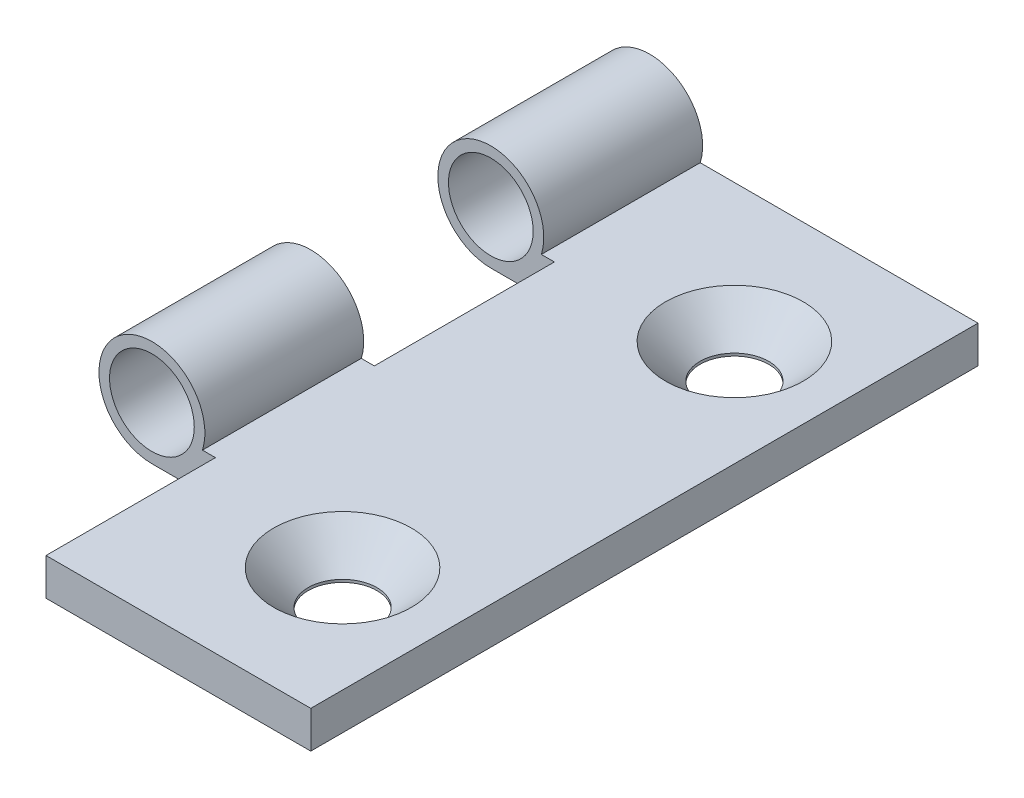
ISO-10303-21;
HEADER;
FILE_DESCRIPTION(('STEP AP214'),'2;1');
FILE_NAME('part.step','',(''),(''),'','','');
FILE_SCHEMA(('AUTOMOTIVE_DESIGN { 1 0 10303 214 1 1 1 1 }'));
ENDSEC;
DATA;
#1=APPLICATION_CONTEXT('core data for automotive mechanical design processes');
#2=APPLICATION_PROTOCOL_DEFINITION('international standard','automotive_design',2000,#1);
#3=PRODUCT_CONTEXT('',#1,'mechanical');
#4=PRODUCT('Part','Part','',(#3));
#5=PRODUCT_RELATED_PRODUCT_CATEGORY('part','',(#4));
#6=PRODUCT_DEFINITION_FORMATION('','',#4);
#7=PRODUCT_DEFINITION_CONTEXT('part definition',#1,'design');
#8=PRODUCT_DEFINITION('design','',#6,#7);
#9=PRODUCT_DEFINITION_SHAPE('','',#8);
#10=(LENGTH_UNIT() NAMED_UNIT(*) SI_UNIT(.MILLI.,.METRE.));
#11=(NAMED_UNIT(*) PLANE_ANGLE_UNIT() SI_UNIT($,.RADIAN.));
#12=(NAMED_UNIT(*) SI_UNIT($,.STERADIAN.) SOLID_ANGLE_UNIT());
#13=UNCERTAINTY_MEASURE_WITH_UNIT(LENGTH_MEASURE(1.E-05),#10,'distance_accuracy_value','');
#14=(GEOMETRIC_REPRESENTATION_CONTEXT(3) GLOBAL_UNCERTAINTY_ASSIGNED_CONTEXT((#13)) GLOBAL_UNIT_ASSIGNED_CONTEXT((#10,
#11,#12)) REPRESENTATION_CONTEXT('',''));
#15=CARTESIAN_POINT('',(0.,0.,0.));
#16=DIRECTION('',(0.,0.,1.));
#17=DIRECTION('',(1.,0.,0.));
#18=AXIS2_PLACEMENT_3D('',#15,#16,#17);
#19=CARTESIAN_POINT('',(20.9999999999997,3.50000000003098,-18.5));
#20=DIRECTION('',(0.,1.,0.));
#21=DIRECTION('',(-1.,0.,0.));
#22=AXIS2_PLACEMENT_3D('',#19,#20,#21);
#23=CONICAL_SURFACE('',#22,6.50000000011517,0.785398163406194);
#24=CARTESIAN_POINT('',(20.9999999999997,3.49999999993264,-18.5));
#25=DIRECTION('',(0.,-1.,0.));
#26=DIRECTION('',(-1.,0.,0.));
#27=AXIS2_PLACEMENT_3D('',#24,#25,#26);
#28=CIRCLE('',#27,6.50000000001683);
#29=CARTESIAN_POINT('',(14.4999999999828,3.49999999993264,-18.5));
#30=VERTEX_POINT('',#29);
#31=EDGE_CURVE('E41',#30,#30,#28,.T.);
#32=ORIENTED_EDGE('',*,*,#31,.F.);
#33=EDGE_LOOP('',(#32));
#34=FACE_BOUND('',#33,.T.);
#35=CARTESIAN_POINT('',(20.9999999999999,0.249999999994588,-18.4999999999984));
#36=DIRECTION('',(0.,-1.,0.));
#37=DIRECTION('',(-1.,0.,0.));
#38=AXIS2_PLACEMENT_3D('',#35,#36,#37);
#39=CIRCLE('',#38,3.25);
#40=CARTESIAN_POINT('',(17.7499999999999,0.249999999994588,-18.4999999999984));
#41=VERTEX_POINT('',#40);
#42=EDGE_CURVE('E288',#41,#41,#39,.F.);
#43=ORIENTED_EDGE('',*,*,#42,.F.);
#44=EDGE_LOOP('',(#43));
#45=FACE_BOUND('',#44,.T.);
#46=ADVANCED_FACE('F38',(#34,#45),#23,.F.);
#47=CARTESIAN_POINT('',(20.9999999999999,3.49999999991729,18.5));
#48=DIRECTION('',(0.,1.,0.));
#49=DIRECTION('',(-1.,0.,0.));
#50=AXIS2_PLACEMENT_3D('',#47,#48,#49);
#51=CONICAL_SURFACE('',#50,6.50000000005855,0.785398163414939);
#52=CARTESIAN_POINT('',(20.9999999999999,3.49999999993242,18.5));
#53=DIRECTION('',(0.,-1.,0.));
#54=DIRECTION('',(-1.,0.,0.));
#55=AXIS2_PLACEMENT_3D('',#52,#53,#54);
#56=CIRCLE('',#55,6.50000000007367);
#57=CARTESIAN_POINT('',(14.4999999999262,3.49999999993242,18.5));
#58=VERTEX_POINT('',#57);
#59=EDGE_CURVE('E132',#58,#58,#56,.T.);
#60=ORIENTED_EDGE('',*,*,#59,.F.);
#61=EDGE_LOOP('',(#60));
#62=FACE_BOUND('',#61,.T.);
#63=CARTESIAN_POINT('',(20.9999999999999,0.249999999996586,18.5));
#64=DIRECTION('',(0.,-1.,0.));
#65=DIRECTION('',(-1.,0.,0.));
#66=AXIS2_PLACEMENT_3D('',#63,#64,#65);
#67=CIRCLE('',#66,3.25);
#68=CARTESIAN_POINT('',(17.7499999999999,0.249999999996586,18.5));
#69=VERTEX_POINT('',#68);
#70=EDGE_CURVE('E290',#69,#69,#67,.F.);
#71=ORIENTED_EDGE('',*,*,#70,.F.);
#72=EDGE_LOOP('',(#71));
#73=FACE_BOUND('',#72,.T.);
#74=ADVANCED_FACE('F285',(#62,#73),#51,.F.);
#75=CARTESIAN_POINT('',(0.,4.99999999999814,-31.5000000000001));
#76=DIRECTION('',(0.,0.,-1.));
#77=DIRECTION('',(1.,0.,0.));
#78=AXIS2_PLACEMENT_3D('',#75,#76,#77);
#79=CYLINDRICAL_SURFACE('',#78,3.99999999999994);
#80=CARTESIAN_POINT('',(0.,4.99999999999814,-16.5));
#81=DIRECTION('',(0.,0.,1.));
#82=DIRECTION('',(1.,0.,0.));
#83=AXIS2_PLACEMENT_3D('',#80,#81,#82);
#84=CIRCLE('',#83,3.99999999999994);
#85=CARTESIAN_POINT('',(3.99999999999999,4.99999999999814,-16.5));
#86=VERTEX_POINT('',#85);
#87=EDGE_CURVE('E217',#86,#86,#84,.T.);
#88=ORIENTED_EDGE('',*,*,#87,.T.);
#89=EDGE_LOOP('',(#88));
#90=FACE_BOUND('',#89,.T.);
#91=CARTESIAN_POINT('',(0.,4.99999999999814,-31.5000000000001));
#92=DIRECTION('',(0.,0.,1.));
#93=DIRECTION('',(1.,0.,0.));
#94=AXIS2_PLACEMENT_3D('',#91,#92,#93);
#95=CIRCLE('',#94,3.99999999999994);
#96=CARTESIAN_POINT('',(3.99999999999994,4.99999999999814,-31.5000000000001));
#97=VERTEX_POINT('',#96);
#98=EDGE_CURVE('E261',#97,#97,#95,.F.);
#99=ORIENTED_EDGE('',*,*,#98,.T.);
#100=EDGE_LOOP('',(#99));
#101=FACE_BOUND('',#100,.T.);
#102=ADVANCED_FACE('F369',(#90,#101),#79,.F.);
#103=CARTESIAN_POINT('',(0.,4.99999999999814,-31.5000000000001));
#104=DIRECTION('',(0.,0.,-1.));
#105=DIRECTION('',(1.,0.,0.));
#106=AXIS2_PLACEMENT_3D('',#103,#104,#105);
#107=CYLINDRICAL_SURFACE('',#106,3.99999999999994);
#108=CARTESIAN_POINT('',(1.66533453693773E-13,4.9999999999982,15.5000000000001));
#109=DIRECTION('',(0.,0.,1.));
#110=DIRECTION('',(1.,0.,0.));
#111=AXIS2_PLACEMENT_3D('',#108,#109,#110);
#112=CIRCLE('',#111,3.99999999999994);
#113=CARTESIAN_POINT('',(4.00000000000011,4.9999999999982,15.5000000000001));
#114=VERTEX_POINT('',#113);
#115=EDGE_CURVE('E168',#114,#114,#112,.T.);
#116=ORIENTED_EDGE('',*,*,#115,.T.);
#117=EDGE_LOOP('',(#116));
#118=FACE_BOUND('',#117,.T.);
#119=CARTESIAN_POINT('',(1.2490009027033E-13,4.99999999999814,0.499999999999945));
#120=DIRECTION('',(0.,0.,1.));
#121=DIRECTION('',(1.,0.,0.));
#122=AXIS2_PLACEMENT_3D('',#119,#120,#121);
#123=CIRCLE('',#122,3.99999999999994);
#124=CARTESIAN_POINT('',(4.00000000000006,4.99999999999814,0.499999999999929));
#125=VERTEX_POINT('',#124);
#126=EDGE_CURVE('E140',#125,#125,#123,.F.);
#127=ORIENTED_EDGE('',*,*,#126,.T.);
#128=EDGE_LOOP('',(#127));
#129=FACE_BOUND('',#128,.T.);
#130=ADVANCED_FACE('F366',(#118,#129),#107,.F.);
#131=CARTESIAN_POINT('',(30.9999999999999,3.49999999999806,-31.5000000000016));
#132=DIRECTION('',(0.,-1.,0.));
#133=DIRECTION('',(1.,0.,0.));
#134=AXIS2_PLACEMENT_3D('',#131,#132,#133);
#135=PLANE('',#134);
#136=DIRECTION('',(1.,0.,0.));
#137=VECTOR('',#136,1.);
#138=CARTESIAN_POINT('',(0.,3.49999999999809,-31.5000000000001));
#139=LINE('',#138,#137);
#140=CARTESIAN_POINT('',(30.9999999999997,3.49999999999806,-31.5000000000001));
#141=VERTEX_POINT('',#140);
#142=CARTESIAN_POINT('',(4.76969600708463,3.49999999999809,-31.5000000000001));
#143=VERTEX_POINT('',#142);
#144=EDGE_CURVE('E260',#141,#143,#139,.F.);
#145=ORIENTED_EDGE('',*,*,#144,.T.);
#146=DIRECTION('',(0.,0.,-1.));
#147=VECTOR('',#146,1.);
#148=CARTESIAN_POINT('',(4.76969600708464,3.49999999999809,-31.5000000000016));
#149=LINE('',#148,#147);
#150=CARTESIAN_POINT('',(4.76969600708467,3.49999999999809,-16.5));
#151=VERTEX_POINT('',#150);
#152=EDGE_CURVE('E131',#143,#151,#149,.F.);
#153=ORIENTED_EDGE('',*,*,#152,.T.);
#154=DIRECTION('',(-1.,0.,0.));
#155=VECTOR('',#154,1.);
#156=CARTESIAN_POINT('',(-6.9999999999999,3.49999999999809,-16.5));
#157=LINE('',#156,#155);
#158=CARTESIAN_POINT('',(6.00000000000001,3.49999999999728,-16.5));
#159=VERTEX_POINT('',#158);
#160=EDGE_CURVE('E213',#151,#159,#157,.F.);
#161=ORIENTED_EDGE('',*,*,#160,.T.);
#162=DIRECTION('',(0.,0.,-1.));
#163=VECTOR('',#162,1.);
#164=CARTESIAN_POINT('',(6.00000000000001,3.49999999999689,-16.5));
#165=LINE('',#164,#163);
#166=CARTESIAN_POINT('',(6.00000000000006,3.49999999999692,0.499999999999945));
#167=VERTEX_POINT('',#166);
#168=EDGE_CURVE('E139',#159,#167,#165,.F.);
#169=ORIENTED_EDGE('',*,*,#168,.T.);
#170=DIRECTION('',(1.,0.,0.));
#171=VECTOR('',#170,1.);
#172=CARTESIAN_POINT('',(6.00000000000001,3.49999999999695,0.499999999999945));
#173=LINE('',#172,#171);
#174=CARTESIAN_POINT('',(4.76969600708463,3.49999999999753,0.499999999999945));
#175=VERTEX_POINT('',#174);
#176=EDGE_CURVE('E116',#167,#175,#173,.F.);
#177=ORIENTED_EDGE('',*,*,#176,.T.);
#178=DIRECTION('',(0.,0.,-1.));
#179=VECTOR('',#178,1.);
#180=CARTESIAN_POINT('',(4.76969600708485,3.49999999999809,-31.5000000000016));
#181=LINE('',#180,#179);
#182=CARTESIAN_POINT('',(4.76969600708484,3.49999999999825,15.499999999999));
#183=VERTEX_POINT('',#182);
#184=EDGE_CURVE('E124',#175,#183,#181,.F.);
#185=ORIENTED_EDGE('',*,*,#184,.T.);
#186=DIRECTION('',(-1.,0.,0.));
#187=VECTOR('',#186,1.);
#188=CARTESIAN_POINT('',(-4.99999999999992,3.49999999999828,15.4999999999985));
#189=LINE('',#188,#187);
#190=CARTESIAN_POINT('',(6.0000000000002,3.49999999999831,15.4999999999985));
#191=VERTEX_POINT('',#190);
#192=EDGE_CURVE('E164',#183,#191,#189,.F.);
#193=ORIENTED_EDGE('',*,*,#192,.T.);
#194=DIRECTION('',(0.,0.,-1.));
#195=VECTOR('',#194,1.);
#196=CARTESIAN_POINT('',(6.0000000000002,3.49999999999834,15.4999999999985));
#197=LINE('',#196,#195);
#198=CARTESIAN_POINT('',(6.00000000000027,3.49999999999864,31.5000000000001));
#199=VERTEX_POINT('',#198);
#200=EDGE_CURVE('E184',#191,#199,#197,.F.);
#201=ORIENTED_EDGE('',*,*,#200,.T.);
#202=DIRECTION('',(1.,0.,0.));
#203=VECTOR('',#202,1.);
#204=CARTESIAN_POINT('',(1.94289029309402E-13,3.49999999999945,31.5000000000001));
#205=LINE('',#204,#203);
#206=CARTESIAN_POINT('',(30.9999999999998,3.49999999999898,31.4999999999999));
#207=VERTEX_POINT('',#206);
#208=EDGE_CURVE('E324',#207,#199,#205,.F.);
#209=ORIENTED_EDGE('',*,*,#208,.F.);
#210=DIRECTION('',(0.,0.,-1.));
#211=VECTOR('',#210,1.);
#212=CARTESIAN_POINT('',(30.9999999999997,3.49999999999806,-31.5000000000001));
#213=LINE('',#212,#211);
#214=EDGE_CURVE('E253',#141,#207,#213,.F.);
#215=ORIENTED_EDGE('',*,*,#214,.F.);
#216=EDGE_LOOP('',(#145,#153,#161,#169,#177,#185,#193,#201,#209,#215));
#217=FACE_BOUND('',#216,.T.);
#218=ORIENTED_EDGE('',*,*,#59,.T.);
#219=EDGE_LOOP('',(#218));
#220=FACE_BOUND('',#219,.T.);
#221=ORIENTED_EDGE('',*,*,#31,.T.);
#222=EDGE_LOOP('',(#221));
#223=FACE_BOUND('',#222,.T.);
#224=ADVANCED_FACE('F135',(#217,#220,#223),#135,.F.);
#225=CARTESIAN_POINT('',(20.9999999999999,-5.49560397189452E-12,-18.4999999999984));
#226=DIRECTION('',(0.,1.,0.));
#227=DIRECTION('',(-1.,0.,0.));
#228=AXIS2_PLACEMENT_3D('',#225,#226,#227);
#229=CYLINDRICAL_SURFACE('',#228,3.25);
#230=ORIENTED_EDGE('',*,*,#42,.T.);
#231=EDGE_LOOP('',(#230));
#232=FACE_BOUND('',#231,.T.);
#233=CARTESIAN_POINT('',(20.9999999999999,-5.49560397189452E-12,-18.4999999999984));
#234=DIRECTION('',(0.,-1.,0.));
#235=DIRECTION('',(-1.,0.,0.));
#236=AXIS2_PLACEMENT_3D('',#233,#234,#235);
#237=CIRCLE('',#236,3.25);
#238=CARTESIAN_POINT('',(17.7499999999999,-5.49560397189452E-12,-18.4999999999984));
#239=VERTEX_POINT('',#238);
#240=EDGE_CURVE('E231',#239,#239,#237,.F.);
#241=ORIENTED_EDGE('',*,*,#240,.F.);
#242=EDGE_LOOP('',(#241));
#243=FACE_BOUND('',#242,.T.);
#244=ADVANCED_FACE('F360',(#232,#243),#229,.F.);
#245=CARTESIAN_POINT('',(20.9999999999999,-3.49720252756924E-12,18.5));
#246=DIRECTION('',(0.,1.,0.));
#247=DIRECTION('',(-1.,0.,0.));
#248=AXIS2_PLACEMENT_3D('',#245,#246,#247);
#249=CYLINDRICAL_SURFACE('',#248,3.25);
#250=ORIENTED_EDGE('',*,*,#70,.T.);
#251=EDGE_LOOP('',(#250));
#252=FACE_BOUND('',#251,.T.);
#253=CARTESIAN_POINT('',(20.9999999999999,-3.49720252756924E-12,18.5));
#254=DIRECTION('',(0.,-1.,0.));
#255=DIRECTION('',(-1.,0.,0.));
#256=AXIS2_PLACEMENT_3D('',#253,#254,#255);
#257=CIRCLE('',#256,3.25);
#258=CARTESIAN_POINT('',(17.7499999999999,-3.49720252756924E-12,18.5));
#259=VERTEX_POINT('',#258);
#260=EDGE_CURVE('E210',#259,#259,#257,.F.);
#261=ORIENTED_EDGE('',*,*,#260,.F.);
#262=EDGE_LOOP('',(#261));
#263=FACE_BOUND('',#262,.T.);
#264=ADVANCED_FACE('F354',(#252,#263),#249,.F.);
#265=CARTESIAN_POINT('',(-6.9999999999999,9.99999999999623,-16.5));
#266=DIRECTION('',(0.,0.,1.));
#267=DIRECTION('',(-1.,0.,0.));
#268=AXIS2_PLACEMENT_3D('',#265,#266,#267);
#269=PLANE('',#268);
#270=DIRECTION('',(0.,1.,0.));
#271=VECTOR('',#270,1.);
#272=CARTESIAN_POINT('',(6.00000000000001,9.99999999999623,-16.5));
#273=LINE('',#272,#271);
#274=CARTESIAN_POINT('',(6.00000000000002,-1.97064586870965E-12,-16.5));
#275=VERTEX_POINT('',#274);
#276=EDGE_CURVE('E120',#275,#159,#273,.T.);
#277=ORIENTED_EDGE('',*,*,#276,.T.);
#278=ORIENTED_EDGE('',*,*,#160,.F.);
#279=CARTESIAN_POINT('',(0.,4.99999999999814,-16.5));
#280=DIRECTION('',(0.,0.,1.));
#281=DIRECTION('',(1.,0.,0.));
#282=AXIS2_PLACEMENT_3D('',#279,#280,#281);
#283=CIRCLE('',#282,4.99999999999992);
#284=CARTESIAN_POINT('',(0.,-1.97064586870965E-12,-16.5));
#285=VERTEX_POINT('',#284);
#286=EDGE_CURVE('E216',#151,#285,#283,.T.);
#287=ORIENTED_EDGE('',*,*,#286,.T.);
#288=DIRECTION('',(-1.,0.,0.));
#289=VECTOR('',#288,1.);
#290=CARTESIAN_POINT('',(-2.22044604925031E-13,-1.97064586870965E-12,-16.5));
#291=LINE('',#290,#289);
#292=EDGE_CURVE('E206',#275,#285,#291,.T.);
#293=ORIENTED_EDGE('',*,*,#292,.F.);
#294=EDGE_LOOP('',(#277,#278,#287,#293));
#295=FACE_BOUND('',#294,.T.);
#296=ORIENTED_EDGE('',*,*,#87,.F.);
#297=EDGE_LOOP('',(#296));
#298=FACE_BOUND('',#297,.T.);
#299=ADVANCED_FACE('F311',(#295,#298),#269,.T.);
#300=CARTESIAN_POINT('',(0.,4.99999999999814,-31.5000000000001));
#301=DIRECTION('',(0.,0.,-1.));
#302=DIRECTION('',(1.,0.,0.));
#303=AXIS2_PLACEMENT_3D('',#300,#301,#302);
#304=CYLINDRICAL_SURFACE('',#303,4.99999999999992);
#305=DIRECTION('',(0.,0.,-1.));
#306=VECTOR('',#305,1.);
#307=CARTESIAN_POINT('',(0.,-1.97064586870965E-12,-31.5000000000001));
#308=LINE('',#307,#306);
#309=CARTESIAN_POINT('',(0.,-1.97064586870965E-12,-31.5000000000001));
#310=VERTEX_POINT('',#309);
#311=EDGE_CURVE('E200',#285,#310,#308,.T.);
#312=ORIENTED_EDGE('',*,*,#311,.F.);
#313=ORIENTED_EDGE('',*,*,#286,.F.);
#314=ORIENTED_EDGE('',*,*,#152,.F.);
#315=CARTESIAN_POINT('',(0.,4.99999999999814,-31.5000000000001));
#316=DIRECTION('',(0.,0.,1.));
#317=DIRECTION('',(1.,0.,0.));
#318=AXIS2_PLACEMENT_3D('',#315,#316,#317);
#319=CIRCLE('',#318,4.99999999999992);
#320=EDGE_CURVE('E238',#143,#310,#319,.T.);
#321=ORIENTED_EDGE('',*,*,#320,.T.);
#322=EDGE_LOOP('',(#312,#313,#314,#321));
#323=FACE_BOUND('',#322,.T.);
#324=ADVANCED_FACE('F346',(#323),#304,.T.);
#325=CARTESIAN_POINT('',(0.,4.99999999999814,-31.5000000000001));
#326=DIRECTION('',(0.,0.,-1.));
#327=DIRECTION('',(1.,0.,0.));
#328=AXIS2_PLACEMENT_3D('',#325,#326,#327);
#329=PLANE('',#328);
#330=ORIENTED_EDGE('',*,*,#144,.F.);
#331=DIRECTION('',(0.,1.,0.));
#332=VECTOR('',#331,1.);
#333=CARTESIAN_POINT('',(30.9999999999997,-1.97064586870965E-12,-31.5000000000001));
#334=LINE('',#333,#332);
#335=CARTESIAN_POINT('',(30.9999999999997,-1.97064586870965E-12,-31.5000000000001));
#336=VERTEX_POINT('',#335);
#337=EDGE_CURVE('E252',#336,#141,#334,.T.);
#338=ORIENTED_EDGE('',*,*,#337,.F.);
#339=DIRECTION('',(-1.,0.,0.));
#340=VECTOR('',#339,1.);
#341=CARTESIAN_POINT('',(-2.22044604925031E-13,-1.97064586870965E-12,-31.5000000000001));
#342=LINE('',#341,#340);
#343=EDGE_CURVE('E205',#310,#336,#342,.F.);
#344=ORIENTED_EDGE('',*,*,#343,.F.);
#345=ORIENTED_EDGE('',*,*,#320,.F.);
#346=EDGE_LOOP('',(#330,#338,#344,#345));
#347=FACE_BOUND('',#346,.T.);
#348=ORIENTED_EDGE('',*,*,#98,.F.);
#349=EDGE_LOOP('',(#348));
#350=FACE_BOUND('',#349,.T.);
#351=ADVANCED_FACE('F343',(#347,#350),#329,.T.);
#352=CARTESIAN_POINT('',(30.9999999999997,-1.97064586870965E-12,-31.5000000000001));
#353=DIRECTION('',(-1.,0.,0.));
#354=DIRECTION('',(0.,0.,-1.));
#355=AXIS2_PLACEMENT_3D('',#352,#353,#354);
#356=PLANE('',#355);
#357=ORIENTED_EDGE('',*,*,#337,.T.);
#358=ORIENTED_EDGE('',*,*,#214,.T.);
#359=DIRECTION('',(0.,1.,0.));
#360=VECTOR('',#359,1.);
#361=CARTESIAN_POINT('',(30.9999999999998,5.00000000000012,31.5000000000003));
#362=LINE('',#361,#360);
#363=CARTESIAN_POINT('',(30.9999999999997,-1.97064586870965E-12,31.4999999999994));
#364=VERTEX_POINT('',#363);
#365=EDGE_CURVE('E192',#364,#207,#362,.T.);
#366=ORIENTED_EDGE('',*,*,#365,.F.);
#367=DIRECTION('',(0.,0.,-1.));
#368=VECTOR('',#367,1.);
#369=CARTESIAN_POINT('',(30.9999999999997,-1.97064586870965E-12,-31.5000000000001));
#370=LINE('',#369,#368);
#371=EDGE_CURVE('E189',#336,#364,#370,.F.);
#372=ORIENTED_EDGE('',*,*,#371,.F.);
#373=EDGE_LOOP('',(#357,#358,#366,#372));
#374=FACE_BOUND('',#373,.T.);
#375=ADVANCED_FACE('F340',(#374),#356,.F.);
#376=CARTESIAN_POINT('',(1.94289029309402E-13,5.00000000000017,31.5000000000001));
#377=DIRECTION('',(0.,0.,-1.));
#378=DIRECTION('',(1.,0.,0.));
#379=AXIS2_PLACEMENT_3D('',#376,#377,#378);
#380=PLANE('',#379);
#381=ORIENTED_EDGE('',*,*,#365,.T.);
#382=ORIENTED_EDGE('',*,*,#208,.T.);
#383=DIRECTION('',(0.,1.,0.));
#384=VECTOR('',#383,1.);
#385=CARTESIAN_POINT('',(6.00000000000027,9.99999999999823,31.4999999999999));
#386=LINE('',#385,#384);
#387=CARTESIAN_POINT('',(6.00000000000024,-1.97064586870965E-12,31.4999999999992));
#388=VERTEX_POINT('',#387);
#389=EDGE_CURVE('E180',#199,#388,#386,.F.);
#390=ORIENTED_EDGE('',*,*,#389,.T.);
#391=DIRECTION('',(-1.,0.,0.));
#392=VECTOR('',#391,1.);
#393=CARTESIAN_POINT('',(-2.4980018054066E-13,-1.9151347174784E-12,31.499999999999));
#394=LINE('',#393,#392);
#395=EDGE_CURVE('E177',#364,#388,#394,.T.);
#396=ORIENTED_EDGE('',*,*,#395,.F.);
#397=EDGE_LOOP('',(#381,#382,#390,#396));
#398=FACE_BOUND('',#397,.T.);
#399=ADVANCED_FACE('F339',(#398),#380,.F.);
#400=CARTESIAN_POINT('',(6.0000000000002,9.99999999999829,15.4999999999985));
#401=DIRECTION('',(-1.,0.,0.));
#402=DIRECTION('',(0.,0.,-1.));
#403=AXIS2_PLACEMENT_3D('',#400,#401,#402);
#404=PLANE('',#403);
#405=ORIENTED_EDGE('',*,*,#200,.F.);
#406=DIRECTION('',(0.,1.,0.));
#407=VECTOR('',#406,1.);
#408=CARTESIAN_POINT('',(6.0000000000002,9.99999999999829,15.4999999999985));
#409=LINE('',#408,#407);
#410=CARTESIAN_POINT('',(6.00000000000021,-1.9151347174784E-12,15.4999999999992));
#411=VERTEX_POINT('',#410);
#412=EDGE_CURVE('E167',#191,#411,#409,.F.);
#413=ORIENTED_EDGE('',*,*,#412,.T.);
#414=DIRECTION('',(0.,0.,-1.));
#415=VECTOR('',#414,1.);
#416=CARTESIAN_POINT('',(6.00000000000024,-1.97064586870965E-12,-31.5000000000001));
#417=LINE('',#416,#415);
#418=EDGE_CURVE('E175',#388,#411,#417,.T.);
#419=ORIENTED_EDGE('',*,*,#418,.F.);
#420=ORIENTED_EDGE('',*,*,#389,.F.);
#421=EDGE_LOOP('',(#405,#413,#419,#420));
#422=FACE_BOUND('',#421,.T.);
#423=ADVANCED_FACE('F424',(#422),#404,.T.);
#424=CARTESIAN_POINT('',(-4.99999999999992,9.99999999999829,15.4999999999985));
#425=DIRECTION('',(0.,0.,1.));
#426=DIRECTION('',(-1.,0.,0.));
#427=AXIS2_PLACEMENT_3D('',#424,#425,#426);
#428=PLANE('',#427);
#429=CARTESIAN_POINT('',(1.66533453693773E-13,4.9999999999982,15.5000000000001));
#430=DIRECTION('',(0.,0.,1.));
#431=DIRECTION('',(1.,0.,0.));
#432=AXIS2_PLACEMENT_3D('',#429,#430,#431);
#433=CIRCLE('',#432,4.99999999999992);
#434=CARTESIAN_POINT('',(1.66533453693773E-13,-1.9151347174784E-12,15.4999999999998));
#435=VERTEX_POINT('',#434);
#436=EDGE_CURVE('E127',#183,#435,#433,.T.);
#437=ORIENTED_EDGE('',*,*,#436,.T.);
#438=DIRECTION('',(-1.,0.,0.));
#439=VECTOR('',#438,1.);
#440=CARTESIAN_POINT('',(-2.4980018054066E-13,-1.9151347174784E-12,15.4999999999996));
#441=LINE('',#440,#439);
#442=EDGE_CURVE('E150',#411,#435,#441,.T.);
#443=ORIENTED_EDGE('',*,*,#442,.F.);
#444=ORIENTED_EDGE('',*,*,#412,.F.);
#445=ORIENTED_EDGE('',*,*,#192,.F.);
#446=EDGE_LOOP('',(#437,#443,#444,#445));
#447=FACE_BOUND('',#446,.T.);
#448=ORIENTED_EDGE('',*,*,#115,.F.);
#449=EDGE_LOOP('',(#448));
#450=FACE_BOUND('',#449,.T.);
#451=ADVANCED_FACE('F318',(#447,#450),#428,.T.);
#452=CARTESIAN_POINT('',(0.,4.99999999999814,-31.5000000000001));
#453=DIRECTION('',(0.,0.,-1.));
#454=DIRECTION('',(1.,0.,0.));
#455=AXIS2_PLACEMENT_3D('',#452,#453,#454);
#456=CYLINDRICAL_SURFACE('',#455,4.99999999999992);
#457=DIRECTION('',(0.,0.,-1.));
#458=VECTOR('',#457,1.);
#459=CARTESIAN_POINT('',(2.08166817117217E-13,-1.97064586870965E-12,-31.5000000000001));
#460=LINE('',#459,#458);
#461=CARTESIAN_POINT('',(1.66533453693773E-13,-1.97064586870965E-12,0.499999999999945));
#462=VERTEX_POINT('',#461);
#463=EDGE_CURVE('E147',#435,#462,#460,.T.);
#464=ORIENTED_EDGE('',*,*,#463,.F.);
#465=ORIENTED_EDGE('',*,*,#436,.F.);
#466=ORIENTED_EDGE('',*,*,#184,.F.);
#467=CARTESIAN_POINT('',(1.2490009027033E-13,4.99999999999814,0.499999999999945));
#468=DIRECTION('',(0.,0.,1.));
#469=DIRECTION('',(1.,0.,0.));
#470=AXIS2_PLACEMENT_3D('',#467,#468,#469);
#471=CIRCLE('',#470,4.99999999999992);
#472=EDGE_CURVE('E110',#175,#462,#471,.T.);
#473=ORIENTED_EDGE('',*,*,#472,.T.);
#474=EDGE_LOOP('',(#464,#465,#466,#473));
#475=FACE_BOUND('',#474,.T.);
#476=ADVANCED_FACE('F125',(#475),#456,.T.);
#477=CARTESIAN_POINT('',(6.00000000000001,9.99999999999823,0.499999999999945));
#478=DIRECTION('',(0.,0.,-1.));
#479=DIRECTION('',(1.,0.,0.));
#480=AXIS2_PLACEMENT_3D('',#477,#478,#479);
#481=PLANE('',#480);
#482=ORIENTED_EDGE('',*,*,#176,.F.);
#483=DIRECTION('',(0.,1.,0.));
#484=VECTOR('',#483,1.);
#485=CARTESIAN_POINT('',(6.00000000000007,9.99999999999623,0.499999999999945));
#486=LINE('',#485,#484);
#487=CARTESIAN_POINT('',(6.00000000000005,-1.97064586870965E-12,0.499999999999945));
#488=VERTEX_POINT('',#487);
#489=EDGE_CURVE('E299',#167,#488,#486,.F.);
#490=ORIENTED_EDGE('',*,*,#489,.T.);
#491=DIRECTION('',(-1.,0.,0.));
#492=VECTOR('',#491,1.);
#493=CARTESIAN_POINT('',(-2.22044604925031E-13,-1.97064586870965E-12,0.499999999999945));
#494=LINE('',#493,#492);
#495=EDGE_CURVE('E48',#462,#488,#494,.F.);
#496=ORIENTED_EDGE('',*,*,#495,.F.);
#497=ORIENTED_EDGE('',*,*,#472,.F.);
#498=EDGE_LOOP('',(#482,#490,#496,#497));
#499=FACE_BOUND('',#498,.T.);
#500=ORIENTED_EDGE('',*,*,#126,.F.);
#501=EDGE_LOOP('',(#500));
#502=FACE_BOUND('',#501,.T.);
#503=ADVANCED_FACE('F112',(#499,#502),#481,.T.);
#504=CARTESIAN_POINT('',(6.00000000000001,9.99999999999623,-16.5));
#505=DIRECTION('',(-1.,0.,0.));
#506=DIRECTION('',(0.,0.,-1.));
#507=AXIS2_PLACEMENT_3D('',#504,#505,#506);
#508=PLANE('',#507);
#509=ORIENTED_EDGE('',*,*,#168,.F.);
#510=ORIENTED_EDGE('',*,*,#276,.F.);
#511=DIRECTION('',(0.,0.,-1.));
#512=VECTOR('',#511,1.);
#513=CARTESIAN_POINT('',(6.00000000000002,-1.97064586870965E-12,-31.5000000000001));
#514=LINE('',#513,#512);
#515=EDGE_CURVE('E12',#488,#275,#514,.T.);
#516=ORIENTED_EDGE('',*,*,#515,.F.);
#517=ORIENTED_EDGE('',*,*,#489,.F.);
#518=EDGE_LOOP('',(#509,#510,#516,#517));
#519=FACE_BOUND('',#518,.T.);
#520=ADVANCED_FACE('F307',(#519),#508,.T.);
#521=CARTESIAN_POINT('',(-2.22044604925031E-13,-1.97064586870965E-12,-31.5000000000001));
#522=DIRECTION('',(0.,1.,0.));
#523=DIRECTION('',(-1.,0.,0.));
#524=AXIS2_PLACEMENT_3D('',#521,#522,#523);
#525=PLANE('',#524);
#526=ORIENTED_EDGE('',*,*,#495,.T.);
#527=ORIENTED_EDGE('',*,*,#515,.T.);
#528=ORIENTED_EDGE('',*,*,#292,.T.);
#529=ORIENTED_EDGE('',*,*,#311,.T.);
#530=ORIENTED_EDGE('',*,*,#343,.T.);
#531=ORIENTED_EDGE('',*,*,#371,.T.);
#532=ORIENTED_EDGE('',*,*,#395,.T.);
#533=ORIENTED_EDGE('',*,*,#418,.T.);
#534=ORIENTED_EDGE('',*,*,#442,.T.);
#535=ORIENTED_EDGE('',*,*,#463,.T.);
#536=EDGE_LOOP('',(#526,#527,#528,#529,#530,#531,#532,#533,#534,#535));
#537=FACE_BOUND('',#536,.T.);
#538=ORIENTED_EDGE('',*,*,#260,.T.);
#539=EDGE_LOOP('',(#538));
#540=FACE_BOUND('',#539,.T.);
#541=ORIENTED_EDGE('',*,*,#240,.T.);
#542=EDGE_LOOP('',(#541));
#543=FACE_BOUND('',#542,.T.);
#544=ADVANCED_FACE('F315',(#537,#540,#543),#525,.F.);
#545=CLOSED_SHELL('',(#46,#74,#102,#130,#224,#244,#264,#299,#324,#351,#375,#399,#423,#451,#476,
#503,#520,#544));
#546=MANIFOLD_SOLID_BREP('B2',#545);
#547=ADVANCED_BREP_SHAPE_REPRESENTATION('',(#18,#546),#14);
#548=SHAPE_DEFINITION_REPRESENTATION(#9,#547);
ENDSEC;
END-ISO-10303-21;
